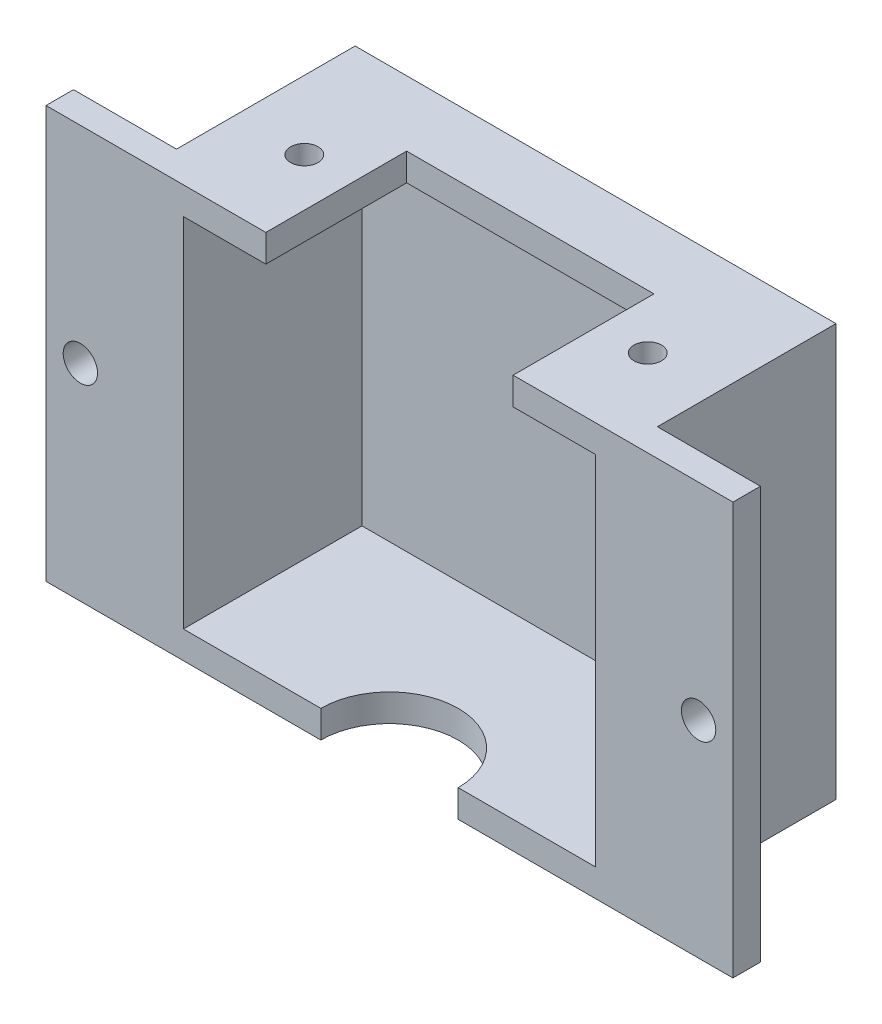
ISO-10303-21;
HEADER;
FILE_DESCRIPTION(('STEP AP214'),'2;1');
FILE_NAME('part.step','',(''),(''),'','','');
FILE_SCHEMA(('AUTOMOTIVE_DESIGN { 1 0 10303 214 1 1 1 1 }'));
ENDSEC;
DATA;
#1=APPLICATION_CONTEXT('core data for automotive mechanical design processes');
#2=APPLICATION_PROTOCOL_DEFINITION('international standard','automotive_design',2000,#1);
#3=PRODUCT_CONTEXT('',#1,'mechanical');
#4=PRODUCT('Part','Part','',(#3));
#5=PRODUCT_RELATED_PRODUCT_CATEGORY('part','',(#4));
#6=PRODUCT_DEFINITION_FORMATION('','',#4);
#7=PRODUCT_DEFINITION_CONTEXT('part definition',#1,'design');
#8=PRODUCT_DEFINITION('design','',#6,#7);
#9=PRODUCT_DEFINITION_SHAPE('','',#8);
#10=(LENGTH_UNIT() NAMED_UNIT(*) SI_UNIT(.MILLI.,.METRE.));
#11=(NAMED_UNIT(*) PLANE_ANGLE_UNIT() SI_UNIT($,.RADIAN.));
#12=(NAMED_UNIT(*) SI_UNIT($,.STERADIAN.) SOLID_ANGLE_UNIT());
#13=UNCERTAINTY_MEASURE_WITH_UNIT(LENGTH_MEASURE(1.E-05),#10,'distance_accuracy_value','');
#14=(GEOMETRIC_REPRESENTATION_CONTEXT(3) GLOBAL_UNCERTAINTY_ASSIGNED_CONTEXT((#13)) GLOBAL_UNIT_ASSIGNED_CONTEXT((#10,
#11,#12)) REPRESENTATION_CONTEXT('',''));
#15=CARTESIAN_POINT('',(0.,0.,0.));
#16=DIRECTION('',(0.,0.,1.));
#17=DIRECTION('',(1.,0.,0.));
#18=AXIS2_PLACEMENT_3D('',#15,#16,#17);
#19=CARTESIAN_POINT('',(0.,0.,15.));
#20=DIRECTION('',(0.,0.,1.));
#21=DIRECTION('',(1.,0.,0.));
#22=AXIS2_PLACEMENT_3D('',#19,#20,#21);
#23=PLANE('',#22);
#24=CARTESIAN_POINT('',(-22.5,0.,15.));
#25=DIRECTION('',(0.,0.,1.));
#26=DIRECTION('',(1.,0.,0.));
#27=AXIS2_PLACEMENT_3D('',#24,#25,#26);
#28=CIRCLE('',#27,1.25);
#29=CARTESIAN_POINT('',(-21.25,0.,15.));
#30=VERTEX_POINT('',#29);
#31=EDGE_CURVE('E222',#30,#30,#28,.T.);
#32=ORIENTED_EDGE('',*,*,#31,.F.);
#33=EDGE_LOOP('',(#32));
#34=FACE_BOUND('',#33,.T.);
#35=DIRECTION('',(0.,-1.,0.));
#36=VECTOR('',#35,1.);
#37=CARTESIAN_POINT('',(-4.99999999999999,35.,15.));
#38=LINE('',#37,#36);
#39=CARTESIAN_POINT('',(-4.99999999999999,-13.,15.));
#40=VERTEX_POINT('',#39);
#41=CARTESIAN_POINT('',(-4.99999999999999,-15.,15.));
#42=VERTEX_POINT('',#41);
#43=EDGE_CURVE('E160',#40,#42,#38,.T.);
#44=ORIENTED_EDGE('',*,*,#43,.F.);
#45=DIRECTION('',(1.,0.,0.));
#46=VECTOR('',#45,1.);
#47=CARTESIAN_POINT('',(-15.,-13.,15.));
#48=LINE('',#47,#46);
#49=CARTESIAN_POINT('',(-15.,-13.,15.));
#50=VERTEX_POINT('',#49);
#51=EDGE_CURVE('E270',#50,#40,#48,.T.);
#52=ORIENTED_EDGE('',*,*,#51,.F.);
#53=DIRECTION('',(0.,-1.,0.));
#54=VECTOR('',#53,1.);
#55=CARTESIAN_POINT('',(-15.,13.,15.));
#56=LINE('',#55,#54);
#57=CARTESIAN_POINT('',(-15.,13.,15.));
#58=VERTEX_POINT('',#57);
#59=EDGE_CURVE('E285',#58,#50,#56,.T.);
#60=ORIENTED_EDGE('',*,*,#59,.F.);
#61=DIRECTION('',(-1.,0.,0.));
#62=VECTOR('',#61,1.);
#63=CARTESIAN_POINT('',(-15.,13.,15.));
#64=LINE('',#63,#62);
#65=CARTESIAN_POINT('',(-9.,13.,15.));
#66=VERTEX_POINT('',#65);
#67=EDGE_CURVE('E282',#66,#58,#64,.T.);
#68=ORIENTED_EDGE('',*,*,#67,.F.);
#69=DIRECTION('',(0.,1.,0.));
#70=VECTOR('',#69,1.);
#71=CARTESIAN_POINT('',(-9.,10.,15.));
#72=LINE('',#71,#70);
#73=CARTESIAN_POINT('',(-9.,15.,15.));
#74=VERTEX_POINT('',#73);
#75=EDGE_CURVE('E314',#66,#74,#72,.T.);
#76=ORIENTED_EDGE('',*,*,#75,.T.);
#77=DIRECTION('',(-1.,0.,0.));
#78=VECTOR('',#77,1.);
#79=CARTESIAN_POINT('',(-25.,15.,15.));
#80=LINE('',#79,#78);
#81=CARTESIAN_POINT('',(-25.,15.,15.));
#82=VERTEX_POINT('',#81);
#83=EDGE_CURVE('E321',#74,#82,#80,.T.);
#84=ORIENTED_EDGE('',*,*,#83,.T.);
#85=DIRECTION('',(0.,-1.,0.));
#86=VECTOR('',#85,1.);
#87=CARTESIAN_POINT('',(-25.,15.,15.));
#88=LINE('',#87,#86);
#89=CARTESIAN_POINT('',(-25.,-15.,15.));
#90=VERTEX_POINT('',#89);
#91=EDGE_CURVE('E182',#82,#90,#88,.T.);
#92=ORIENTED_EDGE('',*,*,#91,.T.);
#93=DIRECTION('',(1.,0.,0.));
#94=VECTOR('',#93,1.);
#95=CARTESIAN_POINT('',(-25.,-15.,15.));
#96=LINE('',#95,#94);
#97=EDGE_CURVE('E181',#90,#42,#96,.T.);
#98=ORIENTED_EDGE('',*,*,#97,.T.);
#99=EDGE_LOOP('',(#44,#52,#60,#68,#76,#84,#92,#98));
#100=FACE_BOUND('',#99,.T.);
#101=ADVANCED_FACE('F32',(#34,#100),#23,.T.);
#102=CARTESIAN_POINT('',(25.,15.,15.));
#103=DIRECTION('',(-1.,0.,0.));
#104=DIRECTION('',(0.,-1.,0.));
#105=AXIS2_PLACEMENT_3D('',#102,#103,#104);
#106=PLANE('',#105);
#107=DIRECTION('',(0.,0.,-1.));
#108=VECTOR('',#107,1.);
#109=CARTESIAN_POINT('',(25.,-15.,15.));
#110=LINE('',#109,#108);
#111=CARTESIAN_POINT('',(25.,-15.,15.));
#112=VERTEX_POINT('',#111);
#113=CARTESIAN_POINT('',(25.,-15.,13.));
#114=VERTEX_POINT('',#113);
#115=EDGE_CURVE('E179',#112,#114,#110,.T.);
#116=ORIENTED_EDGE('',*,*,#115,.T.);
#117=DIRECTION('',(0.,1.,0.));
#118=VECTOR('',#117,1.);
#119=CARTESIAN_POINT('',(25.,-35.,13.));
#120=LINE('',#119,#118);
#121=CARTESIAN_POINT('',(25.,15.,13.));
#122=VERTEX_POINT('',#121);
#123=EDGE_CURVE('E247',#114,#122,#120,.T.);
#124=ORIENTED_EDGE('',*,*,#123,.T.);
#125=DIRECTION('',(0.,0.,-1.));
#126=VECTOR('',#125,1.);
#127=CARTESIAN_POINT('',(25.,15.,15.));
#128=LINE('',#127,#126);
#129=CARTESIAN_POINT('',(25.,15.,15.));
#130=VERTEX_POINT('',#129);
#131=EDGE_CURVE('E202',#130,#122,#128,.T.);
#132=ORIENTED_EDGE('',*,*,#131,.F.);
#133=DIRECTION('',(0.,1.,0.));
#134=VECTOR('',#133,1.);
#135=CARTESIAN_POINT('',(25.,15.,15.));
#136=LINE('',#135,#134);
#137=EDGE_CURVE('E194',#112,#130,#136,.T.);
#138=ORIENTED_EDGE('',*,*,#137,.F.);
#139=EDGE_LOOP('',(#116,#124,#132,#138));
#140=FACE_BOUND('',#139,.T.);
#141=ADVANCED_FACE('F34',(#140),#106,.F.);
#142=CARTESIAN_POINT('',(-25.,15.,15.));
#143=DIRECTION('',(0.,-1.,0.));
#144=DIRECTION('',(0.,0.,-1.));
#145=AXIS2_PLACEMENT_3D('',#142,#143,#144);
#146=PLANE('',#145);
#147=CARTESIAN_POINT('',(12.5,15.,8.7));
#148=DIRECTION('',(0.,1.,0.));
#149=DIRECTION('',(0.,0.,1.));
#150=AXIS2_PLACEMENT_3D('',#147,#148,#149);
#151=CIRCLE('',#150,1.);
#152=CARTESIAN_POINT('',(12.5,15.,9.7));
#153=VERTEX_POINT('',#152);
#154=EDGE_CURVE('E235',#153,#153,#151,.T.);
#155=ORIENTED_EDGE('',*,*,#154,.F.);
#156=EDGE_LOOP('',(#155));
#157=FACE_BOUND('',#156,.T.);
#158=CARTESIAN_POINT('',(-12.5,15.,8.7));
#159=DIRECTION('',(0.,1.,0.));
#160=DIRECTION('',(0.,0.,1.));
#161=AXIS2_PLACEMENT_3D('',#158,#159,#160);
#162=CIRCLE('',#161,1.);
#163=CARTESIAN_POINT('',(-12.5,15.,9.7));
#164=VERTEX_POINT('',#163);
#165=EDGE_CURVE('E225',#164,#164,#162,.T.);
#166=ORIENTED_EDGE('',*,*,#165,.F.);
#167=EDGE_LOOP('',(#166));
#168=FACE_BOUND('',#167,.T.);
#169=ORIENTED_EDGE('',*,*,#131,.T.);
#170=DIRECTION('',(1.,0.,0.));
#171=VECTOR('',#170,1.);
#172=CARTESIAN_POINT('',(25.,15.,13.));
#173=LINE('',#172,#171);
#174=CARTESIAN_POINT('',(17.5,15.,13.));
#175=VERTEX_POINT('',#174);
#176=EDGE_CURVE('E244',#175,#122,#173,.T.);
#177=ORIENTED_EDGE('',*,*,#176,.F.);
#178=DIRECTION('',(0.,0.,1.));
#179=VECTOR('',#178,1.);
#180=CARTESIAN_POINT('',(17.5,15.,0.));
#181=LINE('',#180,#179);
#182=CARTESIAN_POINT('',(17.5,15.,0.));
#183=VERTEX_POINT('',#182);
#184=EDGE_CURVE('E240',#183,#175,#181,.T.);
#185=ORIENTED_EDGE('',*,*,#184,.F.);
#186=DIRECTION('',(-1.,0.,0.));
#187=VECTOR('',#186,1.);
#188=CARTESIAN_POINT('',(-25.,15.,0.));
#189=LINE('',#188,#187);
#190=CARTESIAN_POINT('',(-17.5,15.,0.));
#191=VERTEX_POINT('',#190);
#192=EDGE_CURVE('E188',#183,#191,#189,.T.);
#193=ORIENTED_EDGE('',*,*,#192,.T.);
#194=DIRECTION('',(0.,0.,-1.));
#195=VECTOR('',#194,1.);
#196=CARTESIAN_POINT('',(-17.5,15.,0.));
#197=LINE('',#196,#195);
#198=CARTESIAN_POINT('',(-17.5,15.,13.));
#199=VERTEX_POINT('',#198);
#200=EDGE_CURVE('E255',#199,#191,#197,.T.);
#201=ORIENTED_EDGE('',*,*,#200,.F.);
#202=DIRECTION('',(1.,0.,0.));
#203=VECTOR('',#202,1.);
#204=CARTESIAN_POINT('',(-25.,15.,13.));
#205=LINE('',#204,#203);
#206=CARTESIAN_POINT('',(-25.,15.,13.));
#207=VERTEX_POINT('',#206);
#208=EDGE_CURVE('E252',#207,#199,#205,.T.);
#209=ORIENTED_EDGE('',*,*,#208,.F.);
#210=DIRECTION('',(0.,0.,-1.));
#211=VECTOR('',#210,1.);
#212=CARTESIAN_POINT('',(-25.,15.,15.));
#213=LINE('',#212,#211);
#214=EDGE_CURVE('E199',#82,#207,#213,.T.);
#215=ORIENTED_EDGE('',*,*,#214,.F.);
#216=ORIENTED_EDGE('',*,*,#83,.F.);
#217=DIRECTION('',(0.,0.,1.));
#218=VECTOR('',#217,1.);
#219=CARTESIAN_POINT('',(-9.,15.,15.));
#220=LINE('',#219,#218);
#221=CARTESIAN_POINT('',(-9.,15.,4.75));
#222=VERTEX_POINT('',#221);
#223=EDGE_CURVE('E305',#222,#74,#220,.T.);
#224=ORIENTED_EDGE('',*,*,#223,.F.);
#225=DIRECTION('',(-1.,0.,0.));
#226=VECTOR('',#225,1.);
#227=CARTESIAN_POINT('',(-9.,15.,4.75));
#228=LINE('',#227,#226);
#229=CARTESIAN_POINT('',(9.,15.,4.75));
#230=VERTEX_POINT('',#229);
#231=EDGE_CURVE('E311',#230,#222,#228,.T.);
#232=ORIENTED_EDGE('',*,*,#231,.F.);
#233=DIRECTION('',(0.,0.,-1.));
#234=VECTOR('',#233,1.);
#235=CARTESIAN_POINT('',(9.,15.,15.));
#236=LINE('',#235,#234);
#237=CARTESIAN_POINT('',(9.,15.,15.));
#238=VERTEX_POINT('',#237);
#239=EDGE_CURVE('E308',#238,#230,#236,.T.);
#240=ORIENTED_EDGE('',*,*,#239,.F.);
#241=EDGE_CURVE('E184',#130,#238,#80,.T.);
#242=ORIENTED_EDGE('',*,*,#241,.F.);
#243=EDGE_LOOP('',(#169,#177,#185,#193,#201,#209,#215,#216,#224,#232,#240,#242));
#244=FACE_BOUND('',#243,.T.);
#245=ADVANCED_FACE('F334',(#157,#168,#244),#146,.F.);
#246=CARTESIAN_POINT('',(-25.,15.,15.));
#247=DIRECTION('',(1.,0.,0.));
#248=DIRECTION('',(0.,1.,0.));
#249=AXIS2_PLACEMENT_3D('',#246,#247,#248);
#250=PLANE('',#249);
#251=ORIENTED_EDGE('',*,*,#214,.T.);
#252=DIRECTION('',(0.,1.,0.));
#253=VECTOR('',#252,1.);
#254=CARTESIAN_POINT('',(-25.,-35.,13.));
#255=LINE('',#254,#253);
#256=CARTESIAN_POINT('',(-25.,-15.,13.));
#257=VERTEX_POINT('',#256);
#258=EDGE_CURVE('E258',#257,#207,#255,.T.);
#259=ORIENTED_EDGE('',*,*,#258,.F.);
#260=DIRECTION('',(0.,0.,-1.));
#261=VECTOR('',#260,1.);
#262=CARTESIAN_POINT('',(-25.,-15.,15.));
#263=LINE('',#262,#261);
#264=EDGE_CURVE('E196',#90,#257,#263,.T.);
#265=ORIENTED_EDGE('',*,*,#264,.F.);
#266=ORIENTED_EDGE('',*,*,#91,.F.);
#267=EDGE_LOOP('',(#251,#259,#265,#266));
#268=FACE_BOUND('',#267,.T.);
#269=ADVANCED_FACE('F338',(#268),#250,.F.);
#270=CARTESIAN_POINT('',(-25.,-15.,15.));
#271=DIRECTION('',(0.,1.,0.));
#272=DIRECTION('',(0.,0.,1.));
#273=AXIS2_PLACEMENT_3D('',#270,#271,#272);
#274=PLANE('',#273);
#275=CARTESIAN_POINT('',(5.00000000000001,-15.,15.));
#276=VERTEX_POINT('',#275);
#277=EDGE_CURVE('E171',#276,#112,#96,.T.);
#278=ORIENTED_EDGE('',*,*,#277,.F.);
#279=CARTESIAN_POINT('',(0.,-15.,15.));
#280=DIRECTION('',(0.,-1.,0.));
#281=DIRECTION('',(0.,0.,-1.));
#282=AXIS2_PLACEMENT_3D('',#279,#280,#281);
#283=CIRCLE('',#282,5.);
#284=EDGE_CURVE('E157',#42,#276,#283,.T.);
#285=ORIENTED_EDGE('',*,*,#284,.F.);
#286=ORIENTED_EDGE('',*,*,#97,.F.);
#287=ORIENTED_EDGE('',*,*,#264,.T.);
#288=DIRECTION('',(1.,0.,0.));
#289=VECTOR('',#288,1.);
#290=CARTESIAN_POINT('',(-25.,-15.,13.));
#291=LINE('',#290,#289);
#292=CARTESIAN_POINT('',(-17.5,-15.,13.));
#293=VERTEX_POINT('',#292);
#294=EDGE_CURVE('E211',#257,#293,#291,.T.);
#295=ORIENTED_EDGE('',*,*,#294,.T.);
#296=DIRECTION('',(0.,0.,-1.));
#297=VECTOR('',#296,1.);
#298=CARTESIAN_POINT('',(-17.5,-15.,15.));
#299=LINE('',#298,#297);
#300=CARTESIAN_POINT('',(-17.5,-15.,0.));
#301=VERTEX_POINT('',#300);
#302=EDGE_CURVE('E261',#293,#301,#299,.T.);
#303=ORIENTED_EDGE('',*,*,#302,.T.);
#304=DIRECTION('',(1.,0.,0.));
#305=VECTOR('',#304,1.);
#306=CARTESIAN_POINT('',(-25.,-15.,0.));
#307=LINE('',#306,#305);
#308=CARTESIAN_POINT('',(17.5,-15.,0.));
#309=VERTEX_POINT('',#308);
#310=EDGE_CURVE('E190',#301,#309,#307,.T.);
#311=ORIENTED_EDGE('',*,*,#310,.T.);
#312=DIRECTION('',(0.,0.,1.));
#313=VECTOR('',#312,1.);
#314=CARTESIAN_POINT('',(17.5,-15.,15.));
#315=LINE('',#314,#313);
#316=CARTESIAN_POINT('',(17.5,-15.,13.));
#317=VERTEX_POINT('',#316);
#318=EDGE_CURVE('E56',#309,#317,#315,.T.);
#319=ORIENTED_EDGE('',*,*,#318,.T.);
#320=DIRECTION('',(1.,0.,0.));
#321=VECTOR('',#320,1.);
#322=CARTESIAN_POINT('',(-25.,-15.,13.));
#323=LINE('',#322,#321);
#324=EDGE_CURVE('E41',#317,#114,#323,.T.);
#325=ORIENTED_EDGE('',*,*,#324,.T.);
#326=ORIENTED_EDGE('',*,*,#115,.F.);
#327=EDGE_LOOP('',(#278,#285,#286,#287,#295,#303,#311,#319,#325,#326));
#328=FACE_BOUND('',#327,.T.);
#329=ADVANCED_FACE('F176',(#328),#274,.F.);
#330=CARTESIAN_POINT('',(22.5,0.,15.));
#331=DIRECTION('',(0.,0.,1.));
#332=DIRECTION('',(1.,0.,0.));
#333=AXIS2_PLACEMENT_3D('',#330,#331,#332);
#334=CIRCLE('',#333,1.25);
#335=CARTESIAN_POINT('',(23.75,0.,15.));
#336=VERTEX_POINT('',#335);
#337=EDGE_CURVE('E219',#336,#336,#334,.T.);
#338=ORIENTED_EDGE('',*,*,#337,.F.);
#339=EDGE_LOOP('',(#338));
#340=FACE_BOUND('',#339,.T.);
#341=DIRECTION('',(0.,-1.,0.));
#342=VECTOR('',#341,1.);
#343=CARTESIAN_POINT('',(5.00000000000001,35.,15.));
#344=LINE('',#343,#342);
#345=CARTESIAN_POINT('',(5.,-13.,15.));
#346=VERTEX_POINT('',#345);
#347=EDGE_CURVE('E49',#346,#276,#344,.T.);
#348=ORIENTED_EDGE('',*,*,#347,.T.);
#349=ORIENTED_EDGE('',*,*,#277,.T.);
#350=ORIENTED_EDGE('',*,*,#137,.T.);
#351=ORIENTED_EDGE('',*,*,#241,.T.);
#352=DIRECTION('',(0.,1.,0.));
#353=VECTOR('',#352,1.);
#354=CARTESIAN_POINT('',(9.,10.,15.));
#355=LINE('',#354,#353);
#356=CARTESIAN_POINT('',(9.,13.,15.));
#357=VERTEX_POINT('',#356);
#358=EDGE_CURVE('E318',#357,#238,#355,.T.);
#359=ORIENTED_EDGE('',*,*,#358,.F.);
#360=CARTESIAN_POINT('',(15.,13.,15.));
#361=VERTEX_POINT('',#360);
#362=EDGE_CURVE('E283',#361,#357,#64,.T.);
#363=ORIENTED_EDGE('',*,*,#362,.F.);
#364=DIRECTION('',(0.,1.,0.));
#365=VECTOR('',#364,1.);
#366=CARTESIAN_POINT('',(15.,13.,15.));
#367=LINE('',#366,#365);
#368=CARTESIAN_POINT('',(15.,-13.,15.));
#369=VERTEX_POINT('',#368);
#370=EDGE_CURVE('E265',#369,#361,#367,.T.);
#371=ORIENTED_EDGE('',*,*,#370,.F.);
#372=EDGE_CURVE('E174',#346,#369,#48,.T.);
#373=ORIENTED_EDGE('',*,*,#372,.F.);
#374=EDGE_LOOP('',(#348,#349,#350,#351,#359,#363,#371,#373));
#375=FACE_BOUND('',#374,.T.);
#376=ADVANCED_FACE('F169',(#340,#375),#23,.T.);
#377=CARTESIAN_POINT('',(0.,0.,0.));
#378=DIRECTION('',(0.,0.,1.));
#379=DIRECTION('',(1.,0.,0.));
#380=AXIS2_PLACEMENT_3D('',#377,#378,#379);
#381=PLANE('',#380);
#382=ORIENTED_EDGE('',*,*,#192,.F.);
#383=DIRECTION('',(0.,-1.,0.));
#384=VECTOR('',#383,1.);
#385=CARTESIAN_POINT('',(17.5,0.,0.));
#386=LINE('',#385,#384);
#387=EDGE_CURVE('E214',#183,#309,#386,.T.);
#388=ORIENTED_EDGE('',*,*,#387,.T.);
#389=ORIENTED_EDGE('',*,*,#310,.F.);
#390=DIRECTION('',(0.,1.,0.));
#391=VECTOR('',#390,1.);
#392=CARTESIAN_POINT('',(-17.5,0.,0.));
#393=LINE('',#392,#391);
#394=EDGE_CURVE('E208',#301,#191,#393,.T.);
#395=ORIENTED_EDGE('',*,*,#394,.T.);
#396=EDGE_LOOP('',(#382,#388,#389,#395));
#397=FACE_BOUND('',#396,.T.);
#398=ADVANCED_FACE('F389',(#397),#381,.F.);
#399=CARTESIAN_POINT('',(-9.,10.,15.));
#400=DIRECTION('',(-1.,0.,0.));
#401=DIRECTION('',(0.,0.,1.));
#402=AXIS2_PLACEMENT_3D('',#399,#400,#401);
#403=PLANE('',#402);
#404=ORIENTED_EDGE('',*,*,#75,.F.);
#405=DIRECTION('',(0.,0.,-1.));
#406=VECTOR('',#405,1.);
#407=CARTESIAN_POINT('',(-9.,13.,15.));
#408=LINE('',#407,#406);
#409=CARTESIAN_POINT('',(-9.,13.,4.75));
#410=VERTEX_POINT('',#409);
#411=EDGE_CURVE('E302',#66,#410,#408,.T.);
#412=ORIENTED_EDGE('',*,*,#411,.T.);
#413=DIRECTION('',(0.,1.,0.));
#414=VECTOR('',#413,1.);
#415=CARTESIAN_POINT('',(-9.,10.,4.75));
#416=LINE('',#415,#414);
#417=EDGE_CURVE('E191',#410,#222,#416,.T.);
#418=ORIENTED_EDGE('',*,*,#417,.T.);
#419=ORIENTED_EDGE('',*,*,#223,.T.);
#420=EDGE_LOOP('',(#404,#412,#418,#419));
#421=FACE_BOUND('',#420,.T.);
#422=ADVANCED_FACE('F349',(#421),#403,.F.);
#423=CARTESIAN_POINT('',(-9.,10.,4.75));
#424=DIRECTION('',(0.,0.,-1.));
#425=DIRECTION('',(-1.,0.,0.));
#426=AXIS2_PLACEMENT_3D('',#423,#424,#425);
#427=PLANE('',#426);
#428=ORIENTED_EDGE('',*,*,#417,.F.);
#429=DIRECTION('',(1.,0.,0.));
#430=VECTOR('',#429,1.);
#431=CARTESIAN_POINT('',(-9.,13.,4.75));
#432=LINE('',#431,#430);
#433=CARTESIAN_POINT('',(9.,13.,4.75));
#434=VERTEX_POINT('',#433);
#435=EDGE_CURVE('E293',#410,#434,#432,.T.);
#436=ORIENTED_EDGE('',*,*,#435,.T.);
#437=DIRECTION('',(0.,1.,0.));
#438=VECTOR('',#437,1.);
#439=CARTESIAN_POINT('',(9.,10.,4.75));
#440=LINE('',#439,#438);
#441=EDGE_CURVE('E316',#434,#230,#440,.T.);
#442=ORIENTED_EDGE('',*,*,#441,.T.);
#443=ORIENTED_EDGE('',*,*,#231,.T.);
#444=EDGE_LOOP('',(#428,#436,#442,#443));
#445=FACE_BOUND('',#444,.T.);
#446=ADVANCED_FACE('F354',(#445),#427,.F.);
#447=CARTESIAN_POINT('',(9.,10.,15.));
#448=DIRECTION('',(1.,0.,0.));
#449=DIRECTION('',(0.,0.,-1.));
#450=AXIS2_PLACEMENT_3D('',#447,#448,#449);
#451=PLANE('',#450);
#452=ORIENTED_EDGE('',*,*,#441,.F.);
#453=DIRECTION('',(0.,0.,1.));
#454=VECTOR('',#453,1.);
#455=CARTESIAN_POINT('',(9.,13.,15.));
#456=LINE('',#455,#454);
#457=EDGE_CURVE('E205',#434,#357,#456,.T.);
#458=ORIENTED_EDGE('',*,*,#457,.T.);
#459=ORIENTED_EDGE('',*,*,#358,.T.);
#460=ORIENTED_EDGE('',*,*,#239,.T.);
#461=EDGE_LOOP('',(#452,#458,#459,#460));
#462=FACE_BOUND('',#461,.T.);
#463=ADVANCED_FACE('F357',(#462),#451,.F.);
#464=CARTESIAN_POINT('',(-15.,13.,2.));
#465=DIRECTION('',(0.,1.,0.));
#466=DIRECTION('',(0.,0.,1.));
#467=AXIS2_PLACEMENT_3D('',#464,#465,#466);
#468=PLANE('',#467);
#469=CARTESIAN_POINT('',(12.5,13.,8.7));
#470=DIRECTION('',(0.,1.,0.));
#471=DIRECTION('',(0.,0.,1.));
#472=AXIS2_PLACEMENT_3D('',#469,#470,#471);
#473=CIRCLE('',#472,1.);
#474=CARTESIAN_POINT('',(12.5,13.,9.7));
#475=VERTEX_POINT('',#474);
#476=EDGE_CURVE('E36',#475,#475,#473,.T.);
#477=ORIENTED_EDGE('',*,*,#476,.T.);
#478=EDGE_LOOP('',(#477));
#479=FACE_BOUND('',#478,.T.);
#480=CARTESIAN_POINT('',(-12.5,13.,8.7));
#481=DIRECTION('',(0.,1.,0.));
#482=DIRECTION('',(0.,0.,1.));
#483=AXIS2_PLACEMENT_3D('',#480,#481,#482);
#484=CIRCLE('',#483,1.);
#485=CARTESIAN_POINT('',(-12.5,13.,9.7));
#486=VERTEX_POINT('',#485);
#487=EDGE_CURVE('E223',#486,#486,#484,.T.);
#488=ORIENTED_EDGE('',*,*,#487,.T.);
#489=EDGE_LOOP('',(#488));
#490=FACE_BOUND('',#489,.T.);
#491=ORIENTED_EDGE('',*,*,#67,.T.);
#492=DIRECTION('',(0.,0.,1.));
#493=VECTOR('',#492,1.);
#494=CARTESIAN_POINT('',(-15.,13.,2.));
#495=LINE('',#494,#493);
#496=CARTESIAN_POINT('',(-15.,13.,2.));
#497=VERTEX_POINT('',#496);
#498=EDGE_CURVE('E296',#497,#58,#495,.T.);
#499=ORIENTED_EDGE('',*,*,#498,.F.);
#500=DIRECTION('',(-1.,0.,0.));
#501=VECTOR('',#500,1.);
#502=CARTESIAN_POINT('',(-15.,13.,2.));
#503=LINE('',#502,#501);
#504=CARTESIAN_POINT('',(15.,13.,2.));
#505=VERTEX_POINT('',#504);
#506=EDGE_CURVE('E269',#505,#497,#503,.T.);
#507=ORIENTED_EDGE('',*,*,#506,.F.);
#508=DIRECTION('',(0.,0.,1.));
#509=VECTOR('',#508,1.);
#510=CARTESIAN_POINT('',(15.,13.,2.));
#511=LINE('',#510,#509);
#512=EDGE_CURVE('E279',#505,#361,#511,.T.);
#513=ORIENTED_EDGE('',*,*,#512,.T.);
#514=ORIENTED_EDGE('',*,*,#362,.T.);
#515=ORIENTED_EDGE('',*,*,#457,.F.);
#516=ORIENTED_EDGE('',*,*,#435,.F.);
#517=ORIENTED_EDGE('',*,*,#411,.F.);
#518=EDGE_LOOP('',(#491,#499,#507,#513,#514,#515,#516,#517));
#519=FACE_BOUND('',#518,.T.);
#520=ADVANCED_FACE('F359',(#479,#490,#519),#468,.F.);
#521=CARTESIAN_POINT('',(15.,13.,2.));
#522=DIRECTION('',(1.,0.,0.));
#523=DIRECTION('',(0.,1.,0.));
#524=AXIS2_PLACEMENT_3D('',#521,#522,#523);
#525=PLANE('',#524);
#526=ORIENTED_EDGE('',*,*,#370,.T.);
#527=ORIENTED_EDGE('',*,*,#512,.F.);
#528=DIRECTION('',(0.,1.,0.));
#529=VECTOR('',#528,1.);
#530=CARTESIAN_POINT('',(15.,13.,2.));
#531=LINE('',#530,#529);
#532=CARTESIAN_POINT('',(15.,-13.,2.));
#533=VERTEX_POINT('',#532);
#534=EDGE_CURVE('E266',#533,#505,#531,.T.);
#535=ORIENTED_EDGE('',*,*,#534,.F.);
#536=DIRECTION('',(0.,0.,1.));
#537=VECTOR('',#536,1.);
#538=CARTESIAN_POINT('',(15.,-13.,2.));
#539=LINE('',#538,#537);
#540=EDGE_CURVE('E290',#533,#369,#539,.T.);
#541=ORIENTED_EDGE('',*,*,#540,.T.);
#542=EDGE_LOOP('',(#526,#527,#535,#541));
#543=FACE_BOUND('',#542,.T.);
#544=ADVANCED_FACE('F363',(#543),#525,.F.);
#545=CARTESIAN_POINT('',(-15.,-13.,2.));
#546=DIRECTION('',(0.,-1.,0.));
#547=DIRECTION('',(0.,0.,-1.));
#548=AXIS2_PLACEMENT_3D('',#545,#546,#547);
#549=PLANE('',#548);
#550=ORIENTED_EDGE('',*,*,#51,.T.);
#551=CARTESIAN_POINT('',(0.,-13.,15.));
#552=DIRECTION('',(0.,-1.,0.));
#553=DIRECTION('',(0.,0.,-1.));
#554=AXIS2_PLACEMENT_3D('',#551,#552,#553);
#555=CIRCLE('',#554,5.);
#556=EDGE_CURVE('E11',#40,#346,#555,.T.);
#557=ORIENTED_EDGE('',*,*,#556,.T.);
#558=ORIENTED_EDGE('',*,*,#372,.T.);
#559=ORIENTED_EDGE('',*,*,#540,.F.);
#560=DIRECTION('',(1.,0.,0.));
#561=VECTOR('',#560,1.);
#562=CARTESIAN_POINT('',(-15.,-13.,2.));
#563=LINE('',#562,#561);
#564=CARTESIAN_POINT('',(-15.,-13.,2.));
#565=VERTEX_POINT('',#564);
#566=EDGE_CURVE('E276',#565,#533,#563,.T.);
#567=ORIENTED_EDGE('',*,*,#566,.F.);
#568=DIRECTION('',(0.,0.,1.));
#569=VECTOR('',#568,1.);
#570=CARTESIAN_POINT('',(-15.,-13.,2.));
#571=LINE('',#570,#569);
#572=EDGE_CURVE('E294',#565,#50,#571,.T.);
#573=ORIENTED_EDGE('',*,*,#572,.T.);
#574=EDGE_LOOP('',(#550,#557,#558,#559,#567,#573));
#575=FACE_BOUND('',#574,.T.);
#576=ADVANCED_FACE('F342',(#575),#549,.F.);
#577=CARTESIAN_POINT('',(-15.,13.,2.));
#578=DIRECTION('',(-1.,0.,0.));
#579=DIRECTION('',(0.,-1.,0.));
#580=AXIS2_PLACEMENT_3D('',#577,#578,#579);
#581=PLANE('',#580);
#582=ORIENTED_EDGE('',*,*,#59,.T.);
#583=ORIENTED_EDGE('',*,*,#572,.F.);
#584=DIRECTION('',(0.,-1.,0.));
#585=VECTOR('',#584,1.);
#586=CARTESIAN_POINT('',(-15.,13.,2.));
#587=LINE('',#586,#585);
#588=EDGE_CURVE('E273',#497,#565,#587,.T.);
#589=ORIENTED_EDGE('',*,*,#588,.F.);
#590=ORIENTED_EDGE('',*,*,#498,.T.);
#591=EDGE_LOOP('',(#582,#583,#589,#590));
#592=FACE_BOUND('',#591,.T.);
#593=ADVANCED_FACE('F346',(#592),#581,.F.);
#594=CARTESIAN_POINT('',(0.,0.,2.));
#595=DIRECTION('',(0.,0.,1.));
#596=DIRECTION('',(1.,0.,0.));
#597=AXIS2_PLACEMENT_3D('',#594,#595,#596);
#598=PLANE('',#597);
#599=ORIENTED_EDGE('',*,*,#534,.T.);
#600=ORIENTED_EDGE('',*,*,#506,.T.);
#601=ORIENTED_EDGE('',*,*,#588,.T.);
#602=ORIENTED_EDGE('',*,*,#566,.T.);
#603=EDGE_LOOP('',(#599,#600,#601,#602));
#604=FACE_BOUND('',#603,.T.);
#605=ADVANCED_FACE('F365',(#604),#598,.T.);
#606=CARTESIAN_POINT('',(-25.,-35.,13.));
#607=DIRECTION('',(0.,0.,1.));
#608=DIRECTION('',(1.,0.,0.));
#609=AXIS2_PLACEMENT_3D('',#606,#607,#608);
#610=PLANE('',#609);
#611=CARTESIAN_POINT('',(-22.5,0.,13.));
#612=DIRECTION('',(0.,0.,1.));
#613=DIRECTION('',(1.,0.,0.));
#614=AXIS2_PLACEMENT_3D('',#611,#612,#613);
#615=CIRCLE('',#614,1.25);
#616=CARTESIAN_POINT('',(-21.25,0.,13.));
#617=VERTEX_POINT('',#616);
#618=EDGE_CURVE('E220',#617,#617,#615,.T.);
#619=ORIENTED_EDGE('',*,*,#618,.T.);
#620=EDGE_LOOP('',(#619));
#621=FACE_BOUND('',#620,.T.);
#622=ORIENTED_EDGE('',*,*,#258,.T.);
#623=ORIENTED_EDGE('',*,*,#208,.T.);
#624=DIRECTION('',(0.,1.,0.));
#625=VECTOR('',#624,1.);
#626=CARTESIAN_POINT('',(-17.5,-35.,13.));
#627=LINE('',#626,#625);
#628=EDGE_CURVE('E259',#293,#199,#627,.T.);
#629=ORIENTED_EDGE('',*,*,#628,.F.);
#630=ORIENTED_EDGE('',*,*,#294,.F.);
#631=EDGE_LOOP('',(#622,#623,#629,#630));
#632=FACE_BOUND('',#631,.T.);
#633=ADVANCED_FACE('F367',(#621,#632),#610,.F.);
#634=CARTESIAN_POINT('',(-17.5,-35.,0.));
#635=DIRECTION('',(1.,0.,0.));
#636=DIRECTION('',(0.,0.,-1.));
#637=AXIS2_PLACEMENT_3D('',#634,#635,#636);
#638=PLANE('',#637);
#639=ORIENTED_EDGE('',*,*,#628,.T.);
#640=ORIENTED_EDGE('',*,*,#200,.T.);
#641=ORIENTED_EDGE('',*,*,#394,.F.);
#642=ORIENTED_EDGE('',*,*,#302,.F.);
#643=EDGE_LOOP('',(#639,#640,#641,#642));
#644=FACE_BOUND('',#643,.T.);
#645=ADVANCED_FACE('F373',(#644),#638,.F.);
#646=CARTESIAN_POINT('',(25.,-35.,13.));
#647=DIRECTION('',(0.,0.,1.));
#648=DIRECTION('',(1.,0.,0.));
#649=AXIS2_PLACEMENT_3D('',#646,#647,#648);
#650=PLANE('',#649);
#651=CARTESIAN_POINT('',(22.5,0.,13.));
#652=DIRECTION('',(0.,0.,1.));
#653=DIRECTION('',(1.,0.,0.));
#654=AXIS2_PLACEMENT_3D('',#651,#652,#653);
#655=CIRCLE('',#654,1.25);
#656=CARTESIAN_POINT('',(23.75,0.,13.));
#657=VERTEX_POINT('',#656);
#658=EDGE_CURVE('E165',#657,#657,#655,.T.);
#659=ORIENTED_EDGE('',*,*,#658,.T.);
#660=EDGE_LOOP('',(#659));
#661=FACE_BOUND('',#660,.T.);
#662=DIRECTION('',(0.,1.,0.));
#663=VECTOR('',#662,1.);
#664=CARTESIAN_POINT('',(17.5,-35.,13.));
#665=LINE('',#664,#663);
#666=EDGE_CURVE('E246',#317,#175,#665,.T.);
#667=ORIENTED_EDGE('',*,*,#666,.T.);
#668=ORIENTED_EDGE('',*,*,#176,.T.);
#669=ORIENTED_EDGE('',*,*,#123,.F.);
#670=ORIENTED_EDGE('',*,*,#324,.F.);
#671=EDGE_LOOP('',(#667,#668,#669,#670));
#672=FACE_BOUND('',#671,.T.);
#673=ADVANCED_FACE('F406',(#661,#672),#650,.F.);
#674=CARTESIAN_POINT('',(17.5,-35.,0.));
#675=DIRECTION('',(-1.,0.,0.));
#676=DIRECTION('',(0.,0.,1.));
#677=AXIS2_PLACEMENT_3D('',#674,#675,#676);
#678=PLANE('',#677);
#679=ORIENTED_EDGE('',*,*,#387,.F.);
#680=ORIENTED_EDGE('',*,*,#184,.T.);
#681=ORIENTED_EDGE('',*,*,#666,.F.);
#682=ORIENTED_EDGE('',*,*,#318,.F.);
#683=EDGE_LOOP('',(#679,#680,#681,#682));
#684=FACE_BOUND('',#683,.T.);
#685=ADVANCED_FACE('F409',(#684),#678,.F.);
#686=CARTESIAN_POINT('',(0.,35.,15.));
#687=DIRECTION('',(0.,-1.,0.));
#688=DIRECTION('',(0.,0.,-1.));
#689=AXIS2_PLACEMENT_3D('',#686,#687,#688);
#690=CYLINDRICAL_SURFACE('',#689,5.);
#691=ORIENTED_EDGE('',*,*,#43,.T.);
#692=ORIENTED_EDGE('',*,*,#284,.T.);
#693=ORIENTED_EDGE('',*,*,#347,.F.);
#694=ORIENTED_EDGE('',*,*,#556,.F.);
#695=EDGE_LOOP('',(#691,#692,#693,#694));
#696=FACE_BOUND('',#695,.T.);
#697=ADVANCED_FACE('F158',(#696),#690,.F.);
#698=CARTESIAN_POINT('',(22.5,0.,-35.));
#699=DIRECTION('',(0.,0.,1.));
#700=DIRECTION('',(1.,0.,0.));
#701=AXIS2_PLACEMENT_3D('',#698,#699,#700);
#702=CYLINDRICAL_SURFACE('',#701,1.25);
#703=ORIENTED_EDGE('',*,*,#337,.T.);
#704=EDGE_LOOP('',(#703));
#705=FACE_BOUND('',#704,.T.);
#706=ORIENTED_EDGE('',*,*,#658,.F.);
#707=EDGE_LOOP('',(#706));
#708=FACE_BOUND('',#707,.T.);
#709=ADVANCED_FACE('F399',(#705,#708),#702,.F.);
#710=CARTESIAN_POINT('',(-22.5,0.,-35.));
#711=DIRECTION('',(0.,0.,1.));
#712=DIRECTION('',(1.,0.,0.));
#713=AXIS2_PLACEMENT_3D('',#710,#711,#712);
#714=CYLINDRICAL_SURFACE('',#713,1.25);
#715=ORIENTED_EDGE('',*,*,#31,.T.);
#716=EDGE_LOOP('',(#715));
#717=FACE_BOUND('',#716,.T.);
#718=ORIENTED_EDGE('',*,*,#618,.F.);
#719=EDGE_LOOP('',(#718));
#720=FACE_BOUND('',#719,.T.);
#721=ADVANCED_FACE('F402',(#717,#720),#714,.F.);
#722=CARTESIAN_POINT('',(-12.5,10.,8.7));
#723=DIRECTION('',(0.,1.,0.));
#724=DIRECTION('',(0.,0.,1.));
#725=AXIS2_PLACEMENT_3D('',#722,#723,#724);
#726=CYLINDRICAL_SURFACE('',#725,1.);
#727=ORIENTED_EDGE('',*,*,#165,.T.);
#728=EDGE_LOOP('',(#727));
#729=FACE_BOUND('',#728,.T.);
#730=ORIENTED_EDGE('',*,*,#487,.F.);
#731=EDGE_LOOP('',(#730));
#732=FACE_BOUND('',#731,.T.);
#733=ADVANCED_FACE('F430',(#729,#732),#726,.F.);
#734=CARTESIAN_POINT('',(12.5,10.,8.7));
#735=DIRECTION('',(0.,1.,0.));
#736=DIRECTION('',(0.,0.,1.));
#737=AXIS2_PLACEMENT_3D('',#734,#735,#736);
#738=CYLINDRICAL_SURFACE('',#737,1.);
#739=ORIENTED_EDGE('',*,*,#154,.T.);
#740=EDGE_LOOP('',(#739));
#741=FACE_BOUND('',#740,.T.);
#742=ORIENTED_EDGE('',*,*,#476,.F.);
#743=EDGE_LOOP('',(#742));
#744=FACE_BOUND('',#743,.T.);
#745=ADVANCED_FACE('F434',(#741,#744),#738,.F.);
#746=CLOSED_SHELL('',(#101,#141,#245,#269,#329,#376,#398,#422,#446,#463,#520,#544,#576,#593,
#605,#633,#645,#673,#685,#697,#709,#721,#733,#745));
#747=MANIFOLD_SOLID_BREP('B2',#746);
#748=ADVANCED_BREP_SHAPE_REPRESENTATION('',(#18,#747),#14);
#749=SHAPE_DEFINITION_REPRESENTATION(#9,#748);
ENDSEC;
END-ISO-10303-21;
